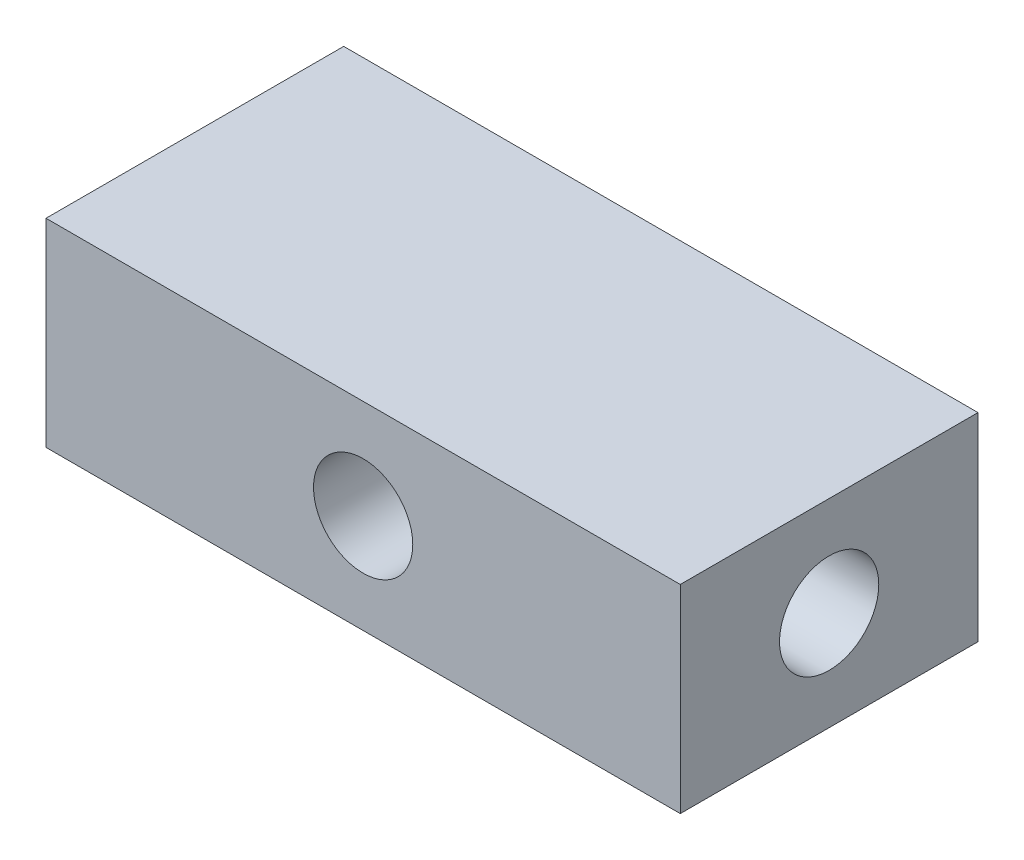
ISO-10303-21;
HEADER;
FILE_DESCRIPTION(('STEP AP214'),'2;1');
FILE_NAME('part.step','',(''),(''),'','','');
FILE_SCHEMA(('AUTOMOTIVE_DESIGN { 1 0 10303 214 1 1 1 1 }'));
ENDSEC;
DATA;
#1=APPLICATION_CONTEXT('core data for automotive mechanical design processes');
#2=APPLICATION_PROTOCOL_DEFINITION('international standard','automotive_design',2000,#1);
#3=PRODUCT_CONTEXT('',#1,'mechanical');
#4=PRODUCT('Part','Part','',(#3));
#5=PRODUCT_RELATED_PRODUCT_CATEGORY('part','',(#4));
#6=PRODUCT_DEFINITION_FORMATION('','',#4);
#7=PRODUCT_DEFINITION_CONTEXT('part definition',#1,'design');
#8=PRODUCT_DEFINITION('design','',#6,#7);
#9=PRODUCT_DEFINITION_SHAPE('','',#8);
#10=(LENGTH_UNIT() NAMED_UNIT(*) SI_UNIT(.MILLI.,.METRE.));
#11=(NAMED_UNIT(*) PLANE_ANGLE_UNIT() SI_UNIT($,.RADIAN.));
#12=(NAMED_UNIT(*) SI_UNIT($,.STERADIAN.) SOLID_ANGLE_UNIT());
#13=UNCERTAINTY_MEASURE_WITH_UNIT(LENGTH_MEASURE(1.E-05),#10,'distance_accuracy_value','');
#14=(GEOMETRIC_REPRESENTATION_CONTEXT(3) GLOBAL_UNCERTAINTY_ASSIGNED_CONTEXT((#13)) GLOBAL_UNIT_ASSIGNED_CONTEXT((#10,
#11,#12)) REPRESENTATION_CONTEXT('',''));
#15=CARTESIAN_POINT('',(0.,0.,0.));
#16=DIRECTION('',(0.,0.,1.));
#17=DIRECTION('',(1.,0.,0.));
#18=AXIS2_PLACEMENT_3D('',#15,#16,#17);
#19=CARTESIAN_POINT('',(-0.0206705418557844,-5.,-15.));
#20=DIRECTION('',(0.,0.,1.));
#21=DIRECTION('',(1.,0.,0.));
#22=AXIS2_PLACEMENT_3D('',#19,#20,#21);
#23=CYLINDRICAL_SURFACE('',#22,2.5);
#24=CARTESIAN_POINT('',(-0.0206705418557844,-5.,0.));
#25=DIRECTION('',(0.,0.,1.));
#26=DIRECTION('',(1.,0.,0.));
#27=AXIS2_PLACEMENT_3D('',#24,#25,#26);
#28=CIRCLE('',#27,2.5);
#29=CARTESIAN_POINT('',(2.47932945814422,-5.,0.));
#30=VERTEX_POINT('',#29);
#31=EDGE_CURVE('E127',#30,#30,#28,.T.);
#32=ORIENTED_EDGE('',*,*,#31,.T.);
#33=EDGE_LOOP('',(#32));
#34=FACE_BOUND('',#33,.T.);
#35=CARTESIAN_POINT('',(-0.0206705418557836,-5.,-7.5));
#36=DIRECTION('',(-0.707106781186547,0.,0.707106781186547));
#37=DIRECTION('',(0.707106781186547,0.,0.707106781186547));
#38=AXIS2_PLACEMENT_3D('',#35,#36,#37);
#39=ELLIPSE('',#38,3.53553390593274,2.5);
#40=CARTESIAN_POINT('',(-0.0206705418557836,-2.5,-7.5));
#41=VERTEX_POINT('',#40);
#42=CARTESIAN_POINT('',(-0.0206705418557836,-7.5,-7.5));
#43=VERTEX_POINT('',#42);
#44=EDGE_CURVE('E45',#41,#43,#39,.F.);
#45=ORIENTED_EDGE('',*,*,#44,.T.);
#46=CARTESIAN_POINT('',(-0.0206705418557836,-5.,-7.5));
#47=DIRECTION('',(0.707106781186547,0.,0.707106781186547));
#48=DIRECTION('',(-0.707106781186547,0.,0.707106781186547));
#49=AXIS2_PLACEMENT_3D('',#46,#47,#48);
#50=ELLIPSE('',#49,3.53553390593274,2.5);
#51=EDGE_CURVE('E11',#43,#41,#50,.F.);
#52=ORIENTED_EDGE('',*,*,#51,.T.);
#53=EDGE_LOOP('',(#45,#52));
#54=FACE_BOUND('',#53,.T.);
#55=ADVANCED_FACE('F32',(#34,#54),#23,.F.);
#56=CARTESIAN_POINT('',(-16.,-10.,-15.));
#57=DIRECTION('',(-1.,0.,0.));
#58=DIRECTION('',(0.,0.,1.));
#59=AXIS2_PLACEMENT_3D('',#56,#57,#58);
#60=PLANE('',#59);
#61=CARTESIAN_POINT('',(-16.,-5.,-7.5));
#62=DIRECTION('',(1.,0.,0.));
#63=DIRECTION('',(0.,0.,-1.));
#64=AXIS2_PLACEMENT_3D('',#61,#62,#63);
#65=CIRCLE('',#64,2.5);
#66=CARTESIAN_POINT('',(-16.,-5.,-10.));
#67=VERTEX_POINT('',#66);
#68=EDGE_CURVE('E130',#67,#67,#65,.T.);
#69=ORIENTED_EDGE('',*,*,#68,.T.);
#70=EDGE_LOOP('',(#69));
#71=FACE_BOUND('',#70,.T.);
#72=DIRECTION('',(0.,0.,1.));
#73=VECTOR('',#72,1.);
#74=CARTESIAN_POINT('',(-16.,0.,-15.));
#75=LINE('',#74,#73);
#76=CARTESIAN_POINT('',(-16.,0.,-15.));
#77=VERTEX_POINT('',#76);
#78=CARTESIAN_POINT('',(-16.,0.,0.));
#79=VERTEX_POINT('',#78);
#80=EDGE_CURVE('E116',#77,#79,#75,.T.);
#81=ORIENTED_EDGE('',*,*,#80,.F.);
#82=DIRECTION('',(0.,1.,0.));
#83=VECTOR('',#82,1.);
#84=CARTESIAN_POINT('',(-16.,-10.,-15.));
#85=LINE('',#84,#83);
#86=CARTESIAN_POINT('',(-16.,-10.,-15.));
#87=VERTEX_POINT('',#86);
#88=EDGE_CURVE('E54',#87,#77,#85,.T.);
#89=ORIENTED_EDGE('',*,*,#88,.F.);
#90=DIRECTION('',(0.,0.,1.));
#91=VECTOR('',#90,1.);
#92=CARTESIAN_POINT('',(-16.,-10.,-15.));
#93=LINE('',#92,#91);
#94=CARTESIAN_POINT('',(-16.,-10.,0.));
#95=VERTEX_POINT('',#94);
#96=EDGE_CURVE('E109',#87,#95,#93,.T.);
#97=ORIENTED_EDGE('',*,*,#96,.T.);
#98=DIRECTION('',(0.,1.,0.));
#99=VECTOR('',#98,1.);
#100=CARTESIAN_POINT('',(-16.,-10.,0.));
#101=LINE('',#100,#99);
#102=EDGE_CURVE('E80',#95,#79,#101,.T.);
#103=ORIENTED_EDGE('',*,*,#102,.T.);
#104=EDGE_LOOP('',(#81,#89,#97,#103));
#105=FACE_BOUND('',#104,.T.);
#106=ADVANCED_FACE('F34',(#71,#105),#60,.T.);
#107=CARTESIAN_POINT('',(-16.,-10.,-15.));
#108=DIRECTION('',(0.,0.,-1.));
#109=DIRECTION('',(-1.,0.,0.));
#110=AXIS2_PLACEMENT_3D('',#107,#108,#109);
#111=PLANE('',#110);
#112=CARTESIAN_POINT('',(-0.0206705418557844,-5.,-15.));
#113=DIRECTION('',(0.,0.,1.));
#114=DIRECTION('',(1.,0.,0.));
#115=AXIS2_PLACEMENT_3D('',#112,#113,#114);
#116=CIRCLE('',#115,2.5);
#117=CARTESIAN_POINT('',(2.47932945814422,-5.,-15.));
#118=VERTEX_POINT('',#117);
#119=EDGE_CURVE('E119',#118,#118,#116,.T.);
#120=ORIENTED_EDGE('',*,*,#119,.T.);
#121=EDGE_LOOP('',(#120));
#122=FACE_BOUND('',#121,.T.);
#123=DIRECTION('',(-1.,0.,0.));
#124=VECTOR('',#123,1.);
#125=CARTESIAN_POINT('',(-16.,0.,-15.));
#126=LINE('',#125,#124);
#127=CARTESIAN_POINT('',(15.9586589162884,0.,-15.));
#128=VERTEX_POINT('',#127);
#129=EDGE_CURVE('E106',#128,#77,#126,.T.);
#130=ORIENTED_EDGE('',*,*,#129,.F.);
#131=DIRECTION('',(0.,1.,0.));
#132=VECTOR('',#131,1.);
#133=CARTESIAN_POINT('',(15.9586589162884,-10.,-15.));
#134=LINE('',#133,#132);
#135=CARTESIAN_POINT('',(15.9586589162884,-10.,-15.));
#136=VERTEX_POINT('',#135);
#137=EDGE_CURVE('E103',#136,#128,#134,.T.);
#138=ORIENTED_EDGE('',*,*,#137,.F.);
#139=DIRECTION('',(-1.,0.,0.));
#140=VECTOR('',#139,1.);
#141=CARTESIAN_POINT('',(-16.,-10.,-15.));
#142=LINE('',#141,#140);
#143=EDGE_CURVE('E101',#136,#87,#142,.T.);
#144=ORIENTED_EDGE('',*,*,#143,.T.);
#145=ORIENTED_EDGE('',*,*,#88,.T.);
#146=EDGE_LOOP('',(#130,#138,#144,#145));
#147=FACE_BOUND('',#146,.T.);
#148=ADVANCED_FACE('F152',(#122,#147),#111,.T.);
#149=CARTESIAN_POINT('',(15.9586589162884,-10.,-15.));
#150=DIRECTION('',(1.,0.,0.));
#151=DIRECTION('',(0.,0.,-1.));
#152=AXIS2_PLACEMENT_3D('',#149,#150,#151);
#153=PLANE('',#152);
#154=CARTESIAN_POINT('',(15.9586589162884,-5.,-7.5));
#155=DIRECTION('',(1.,0.,0.));
#156=DIRECTION('',(0.,0.,-1.));
#157=AXIS2_PLACEMENT_3D('',#154,#155,#156);
#158=CIRCLE('',#157,2.5);
#159=CARTESIAN_POINT('',(15.9586589162884,-5.,-10.));
#160=VERTEX_POINT('',#159);
#161=EDGE_CURVE('E133',#160,#160,#158,.T.);
#162=ORIENTED_EDGE('',*,*,#161,.F.);
#163=EDGE_LOOP('',(#162));
#164=FACE_BOUND('',#163,.T.);
#165=DIRECTION('',(0.,0.,-1.));
#166=VECTOR('',#165,1.);
#167=CARTESIAN_POINT('',(15.9586589162884,0.,-15.));
#168=LINE('',#167,#166);
#169=CARTESIAN_POINT('',(15.9586589162884,0.,0.));
#170=VERTEX_POINT('',#169);
#171=EDGE_CURVE('E110',#170,#128,#168,.T.);
#172=ORIENTED_EDGE('',*,*,#171,.F.);
#173=DIRECTION('',(0.,1.,0.));
#174=VECTOR('',#173,1.);
#175=CARTESIAN_POINT('',(15.9586589162884,-10.,0.));
#176=LINE('',#175,#174);
#177=CARTESIAN_POINT('',(15.9586589162884,-10.,0.));
#178=VERTEX_POINT('',#177);
#179=EDGE_CURVE('E100',#178,#170,#176,.T.);
#180=ORIENTED_EDGE('',*,*,#179,.F.);
#181=DIRECTION('',(0.,0.,-1.));
#182=VECTOR('',#181,1.);
#183=CARTESIAN_POINT('',(15.9586589162884,-10.,-15.));
#184=LINE('',#183,#182);
#185=EDGE_CURVE('E121',#178,#136,#184,.T.);
#186=ORIENTED_EDGE('',*,*,#185,.T.);
#187=ORIENTED_EDGE('',*,*,#137,.T.);
#188=EDGE_LOOP('',(#172,#180,#186,#187));
#189=FACE_BOUND('',#188,.T.);
#190=ADVANCED_FACE('F170',(#164,#189),#153,.T.);
#191=CARTESIAN_POINT('',(-16.,-10.,0.));
#192=DIRECTION('',(0.,0.,1.));
#193=DIRECTION('',(1.,0.,0.));
#194=AXIS2_PLACEMENT_3D('',#191,#192,#193);
#195=PLANE('',#194);
#196=ORIENTED_EDGE('',*,*,#31,.F.);
#197=EDGE_LOOP('',(#196));
#198=FACE_BOUND('',#197,.T.);
#199=DIRECTION('',(1.,0.,0.));
#200=VECTOR('',#199,1.);
#201=CARTESIAN_POINT('',(-16.,0.,0.));
#202=LINE('',#201,#200);
#203=EDGE_CURVE('E113',#79,#170,#202,.T.);
#204=ORIENTED_EDGE('',*,*,#203,.F.);
#205=ORIENTED_EDGE('',*,*,#102,.F.);
#206=DIRECTION('',(1.,0.,0.));
#207=VECTOR('',#206,1.);
#208=CARTESIAN_POINT('',(-16.,-10.,0.));
#209=LINE('',#208,#207);
#210=EDGE_CURVE('E124',#95,#178,#209,.T.);
#211=ORIENTED_EDGE('',*,*,#210,.T.);
#212=ORIENTED_EDGE('',*,*,#179,.T.);
#213=EDGE_LOOP('',(#204,#205,#211,#212));
#214=FACE_BOUND('',#213,.T.);
#215=ADVANCED_FACE('F165',(#198,#214),#195,.T.);
#216=CARTESIAN_POINT('',(-16.,-10.,0.));
#217=DIRECTION('',(0.,1.,0.));
#218=DIRECTION('',(0.,0.,1.));
#219=AXIS2_PLACEMENT_3D('',#216,#217,#218);
#220=PLANE('',#219);
#221=ORIENTED_EDGE('',*,*,#96,.F.);
#222=ORIENTED_EDGE('',*,*,#143,.F.);
#223=ORIENTED_EDGE('',*,*,#185,.F.);
#224=ORIENTED_EDGE('',*,*,#210,.F.);
#225=EDGE_LOOP('',(#221,#222,#223,#224));
#226=FACE_BOUND('',#225,.T.);
#227=ADVANCED_FACE('F159',(#226),#220,.F.);
#228=CARTESIAN_POINT('',(-16.,0.,0.));
#229=DIRECTION('',(0.,1.,0.));
#230=DIRECTION('',(0.,0.,1.));
#231=AXIS2_PLACEMENT_3D('',#228,#229,#230);
#232=PLANE('',#231);
#233=ORIENTED_EDGE('',*,*,#80,.T.);
#234=ORIENTED_EDGE('',*,*,#203,.T.);
#235=ORIENTED_EDGE('',*,*,#171,.T.);
#236=ORIENTED_EDGE('',*,*,#129,.T.);
#237=EDGE_LOOP('',(#233,#234,#235,#236));
#238=FACE_BOUND('',#237,.T.);
#239=ADVANCED_FACE('F155',(#238),#232,.T.);
#240=CARTESIAN_POINT('',(-0.0206705418557836,-5.,-7.5));
#241=DIRECTION('',(-0.707106781186547,0.,0.707106781186547));
#242=DIRECTION('',(0.707106781186547,0.,0.707106781186547));
#243=AXIS2_PLACEMENT_3D('',#240,#241,#242);
#244=ELLIPSE('',#243,3.53553390593274,2.5);
#245=EDGE_CURVE('E88',#41,#43,#244,.T.);
#246=ORIENTED_EDGE('',*,*,#245,.T.);
#247=CARTESIAN_POINT('',(-0.0206705418557836,-5.,-7.5));
#248=DIRECTION('',(0.707106781186547,0.,0.707106781186547));
#249=DIRECTION('',(-0.707106781186547,0.,0.707106781186547));
#250=AXIS2_PLACEMENT_3D('',#247,#248,#249);
#251=ELLIPSE('',#250,3.53553390593274,2.5);
#252=EDGE_CURVE('E40',#43,#41,#251,.T.);
#253=ORIENTED_EDGE('',*,*,#252,.T.);
#254=EDGE_LOOP('',(#246,#253));
#255=FACE_BOUND('',#254,.T.);
#256=ORIENTED_EDGE('',*,*,#119,.F.);
#257=EDGE_LOOP('',(#256));
#258=FACE_BOUND('',#257,.T.);
#259=ADVANCED_FACE('F96',(#255,#258),#23,.F.);
#260=CARTESIAN_POINT('',(-16.,-5.,-7.5));
#261=DIRECTION('',(1.,0.,0.));
#262=DIRECTION('',(0.,0.,-1.));
#263=AXIS2_PLACEMENT_3D('',#260,#261,#262);
#264=CYLINDRICAL_SURFACE('',#263,2.5);
#265=ORIENTED_EDGE('',*,*,#161,.T.);
#266=EDGE_LOOP('',(#265));
#267=FACE_BOUND('',#266,.T.);
#268=ORIENTED_EDGE('',*,*,#44,.F.);
#269=ORIENTED_EDGE('',*,*,#252,.F.);
#270=EDGE_LOOP('',(#268,#269));
#271=FACE_BOUND('',#270,.T.);
#272=ADVANCED_FACE('F94',(#267,#271),#264,.F.);
#273=ORIENTED_EDGE('',*,*,#68,.F.);
#274=EDGE_LOOP('',(#273));
#275=FACE_BOUND('',#274,.T.);
#276=ORIENTED_EDGE('',*,*,#245,.F.);
#277=ORIENTED_EDGE('',*,*,#51,.F.);
#278=EDGE_LOOP('',(#276,#277));
#279=FACE_BOUND('',#278,.T.);
#280=ADVANCED_FACE('F89',(#275,#279),#264,.F.);
#281=CLOSED_SHELL('',(#55,#106,#148,#190,#215,#227,#239,#259,#272,#280));
#282=MANIFOLD_SOLID_BREP('B2',#281);
#283=ADVANCED_BREP_SHAPE_REPRESENTATION('',(#18,#282),#14);
#284=SHAPE_DEFINITION_REPRESENTATION(#9,#283);
ENDSEC;
END-ISO-10303-21;
